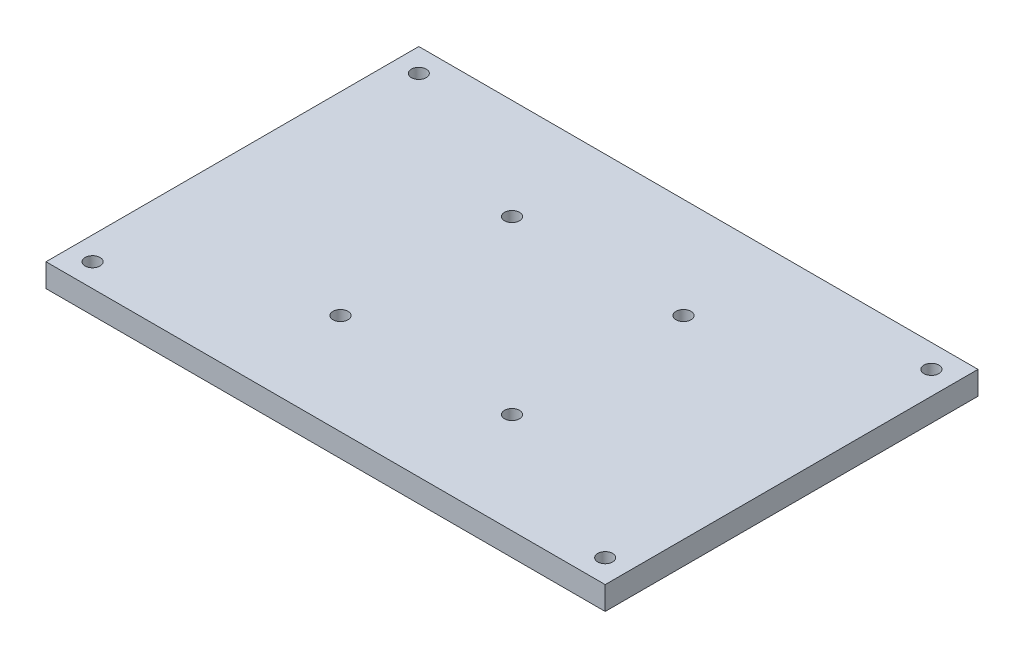
ISO-10303-21;
HEADER;
FILE_DESCRIPTION(('STEP AP214'),'2;1');
FILE_NAME('part.step','',(''),(''),'','','');
FILE_SCHEMA(('AUTOMOTIVE_DESIGN { 1 0 10303 214 1 1 1 1 }'));
ENDSEC;
DATA;
#1=APPLICATION_CONTEXT('core data for automotive mechanical design processes');
#2=APPLICATION_PROTOCOL_DEFINITION('international standard','automotive_design',2000,#1);
#3=PRODUCT_CONTEXT('',#1,'mechanical');
#4=PRODUCT('Part','Part','',(#3));
#5=PRODUCT_RELATED_PRODUCT_CATEGORY('part','',(#4));
#6=PRODUCT_DEFINITION_FORMATION('','',#4);
#7=PRODUCT_DEFINITION_CONTEXT('part definition',#1,'design');
#8=PRODUCT_DEFINITION('design','',#6,#7);
#9=PRODUCT_DEFINITION_SHAPE('','',#8);
#10=(LENGTH_UNIT() NAMED_UNIT(*) SI_UNIT(.MILLI.,.METRE.));
#11=(NAMED_UNIT(*) PLANE_ANGLE_UNIT() SI_UNIT($,.RADIAN.));
#12=(NAMED_UNIT(*) SI_UNIT($,.STERADIAN.) SOLID_ANGLE_UNIT());
#13=UNCERTAINTY_MEASURE_WITH_UNIT(LENGTH_MEASURE(1.E-05),#10,'distance_accuracy_value','');
#14=(GEOMETRIC_REPRESENTATION_CONTEXT(3) GLOBAL_UNCERTAINTY_ASSIGNED_CONTEXT((#13)) GLOBAL_UNIT_ASSIGNED_CONTEXT((#10,
#11,#12)) REPRESENTATION_CONTEXT('',''));
#15=CARTESIAN_POINT('',(0.,0.,0.));
#16=DIRECTION('',(0.,0.,1.));
#17=DIRECTION('',(1.,0.,0.));
#18=AXIS2_PLACEMENT_3D('',#15,#16,#17);
#19=CARTESIAN_POINT('',(0.,5.,0.));
#20=DIRECTION('',(1.,0.,0.));
#21=DIRECTION('',(0.,0.,-1.));
#22=AXIS2_PLACEMENT_3D('',#19,#20,#21);
#23=PLANE('',#22);
#24=DIRECTION('',(0.,0.,1.));
#25=VECTOR('',#24,1.);
#26=CARTESIAN_POINT('',(0.,0.,0.));
#27=LINE('',#26,#25);
#28=CARTESIAN_POINT('',(0.,0.,-80.));
#29=VERTEX_POINT('',#28);
#30=CARTESIAN_POINT('',(0.,0.,0.));
#31=VERTEX_POINT('',#30);
#32=EDGE_CURVE('E95',#29,#31,#27,.T.);
#33=ORIENTED_EDGE('',*,*,#32,.T.);
#34=DIRECTION('',(0.,-1.,0.));
#35=VECTOR('',#34,1.);
#36=CARTESIAN_POINT('',(0.,5.,0.));
#37=LINE('',#36,#35);
#38=CARTESIAN_POINT('',(0.,5.,0.));
#39=VERTEX_POINT('',#38);
#40=EDGE_CURVE('E11',#39,#31,#37,.T.);
#41=ORIENTED_EDGE('',*,*,#40,.F.);
#42=DIRECTION('',(0.,0.,1.));
#43=VECTOR('',#42,1.);
#44=CARTESIAN_POINT('',(0.,5.,0.));
#45=LINE('',#44,#43);
#46=CARTESIAN_POINT('',(0.,5.,-80.));
#47=VERTEX_POINT('',#46);
#48=EDGE_CURVE('E83',#47,#39,#45,.T.);
#49=ORIENTED_EDGE('',*,*,#48,.F.);
#50=DIRECTION('',(0.,-1.,0.));
#51=VECTOR('',#50,1.);
#52=CARTESIAN_POINT('',(0.,5.,-80.));
#53=LINE('',#52,#51);
#54=EDGE_CURVE('E91',#47,#29,#53,.T.);
#55=ORIENTED_EDGE('',*,*,#54,.T.);
#56=EDGE_LOOP('',(#33,#41,#49,#55));
#57=FACE_BOUND('',#56,.T.);
#58=ADVANCED_FACE('F32',(#57),#23,.F.);
#59=CARTESIAN_POINT('',(0.,5.,0.));
#60=DIRECTION('',(0.,0.,-1.));
#61=DIRECTION('',(-1.,0.,0.));
#62=AXIS2_PLACEMENT_3D('',#59,#60,#61);
#63=PLANE('',#62);
#64=DIRECTION('',(1.,0.,0.));
#65=VECTOR('',#64,1.);
#66=CARTESIAN_POINT('',(0.,0.,0.));
#67=LINE('',#66,#65);
#68=CARTESIAN_POINT('',(120.,0.,0.));
#69=VERTEX_POINT('',#68);
#70=EDGE_CURVE('E87',#31,#69,#67,.T.);
#71=ORIENTED_EDGE('',*,*,#70,.T.);
#72=DIRECTION('',(0.,-1.,0.));
#73=VECTOR('',#72,1.);
#74=CARTESIAN_POINT('',(120.,5.,0.));
#75=LINE('',#74,#73);
#76=CARTESIAN_POINT('',(120.,5.,0.));
#77=VERTEX_POINT('',#76);
#78=EDGE_CURVE('E40',#77,#69,#75,.T.);
#79=ORIENTED_EDGE('',*,*,#78,.F.);
#80=DIRECTION('',(1.,0.,0.));
#81=VECTOR('',#80,1.);
#82=CARTESIAN_POINT('',(0.,5.,0.));
#83=LINE('',#82,#81);
#84=EDGE_CURVE('E78',#39,#77,#83,.T.);
#85=ORIENTED_EDGE('',*,*,#84,.F.);
#86=ORIENTED_EDGE('',*,*,#40,.T.);
#87=EDGE_LOOP('',(#71,#79,#85,#86));
#88=FACE_BOUND('',#87,.T.);
#89=ADVANCED_FACE('F86',(#88),#63,.F.);
#90=CARTESIAN_POINT('',(120.,5.,0.));
#91=DIRECTION('',(-1.,0.,0.));
#92=DIRECTION('',(0.,0.,1.));
#93=AXIS2_PLACEMENT_3D('',#90,#91,#92);
#94=PLANE('',#93);
#95=DIRECTION('',(0.,0.,-1.));
#96=VECTOR('',#95,1.);
#97=CARTESIAN_POINT('',(120.,0.,0.));
#98=LINE('',#97,#96);
#99=CARTESIAN_POINT('',(120.,0.,-80.));
#100=VERTEX_POINT('',#99);
#101=EDGE_CURVE('E65',#69,#100,#98,.T.);
#102=ORIENTED_EDGE('',*,*,#101,.T.);
#103=DIRECTION('',(0.,-1.,0.));
#104=VECTOR('',#103,1.);
#105=CARTESIAN_POINT('',(120.,5.,-80.));
#106=LINE('',#105,#104);
#107=CARTESIAN_POINT('',(120.,5.,-80.));
#108=VERTEX_POINT('',#107);
#109=EDGE_CURVE('E88',#108,#100,#106,.T.);
#110=ORIENTED_EDGE('',*,*,#109,.F.);
#111=DIRECTION('',(0.,0.,-1.));
#112=VECTOR('',#111,1.);
#113=CARTESIAN_POINT('',(120.,5.,0.));
#114=LINE('',#113,#112);
#115=EDGE_CURVE('E81',#77,#108,#114,.T.);
#116=ORIENTED_EDGE('',*,*,#115,.F.);
#117=ORIENTED_EDGE('',*,*,#78,.T.);
#118=EDGE_LOOP('',(#102,#110,#116,#117));
#119=FACE_BOUND('',#118,.T.);
#120=ADVANCED_FACE('F89',(#119),#94,.F.);
#121=CARTESIAN_POINT('',(0.,5.,-80.));
#122=DIRECTION('',(0.,0.,1.));
#123=DIRECTION('',(1.,0.,0.));
#124=AXIS2_PLACEMENT_3D('',#121,#122,#123);
#125=PLANE('',#124);
#126=DIRECTION('',(-1.,0.,0.));
#127=VECTOR('',#126,1.);
#128=CARTESIAN_POINT('',(0.,0.,-80.));
#129=LINE('',#128,#127);
#130=EDGE_CURVE('E71',#100,#29,#129,.T.);
#131=ORIENTED_EDGE('',*,*,#130,.T.);
#132=ORIENTED_EDGE('',*,*,#54,.F.);
#133=DIRECTION('',(-1.,0.,0.));
#134=VECTOR('',#133,1.);
#135=CARTESIAN_POINT('',(0.,5.,-80.));
#136=LINE('',#135,#134);
#137=EDGE_CURVE('E48',#108,#47,#136,.T.);
#138=ORIENTED_EDGE('',*,*,#137,.F.);
#139=ORIENTED_EDGE('',*,*,#109,.T.);
#140=EDGE_LOOP('',(#131,#132,#138,#139));
#141=FACE_BOUND('',#140,.T.);
#142=ADVANCED_FACE('F103',(#141),#125,.F.);
#143=CARTESIAN_POINT('',(0.,5.,0.));
#144=DIRECTION('',(0.,-1.,0.));
#145=DIRECTION('',(0.,0.,-1.));
#146=AXIS2_PLACEMENT_3D('',#143,#144,#145);
#147=PLANE('',#146);
#148=CARTESIAN_POINT('',(41.6,5.,-21.6));
#149=DIRECTION('',(0.,1.,0.));
#150=DIRECTION('',(0.,0.,-1.));
#151=AXIS2_PLACEMENT_3D('',#148,#149,#150);
#152=CIRCLE('',#151,1.6);
#153=CARTESIAN_POINT('',(41.6,5.,-23.2));
#154=VERTEX_POINT('',#153);
#155=EDGE_CURVE('E134',#154,#154,#152,.T.);
#156=ORIENTED_EDGE('',*,*,#155,.F.);
#157=EDGE_LOOP('',(#156));
#158=FACE_BOUND('',#157,.T.);
#159=CARTESIAN_POINT('',(78.4,5.,-21.6));
#160=DIRECTION('',(0.,1.,0.));
#161=DIRECTION('',(0.,0.,1.));
#162=AXIS2_PLACEMENT_3D('',#159,#160,#161);
#163=CIRCLE('',#162,1.6);
#164=CARTESIAN_POINT('',(78.4,5.,-20.));
#165=VERTEX_POINT('',#164);
#166=EDGE_CURVE('E128',#165,#165,#163,.T.);
#167=ORIENTED_EDGE('',*,*,#166,.F.);
#168=EDGE_LOOP('',(#167));
#169=FACE_BOUND('',#168,.T.);
#170=CARTESIAN_POINT('',(78.4,5.,-58.4));
#171=DIRECTION('',(0.,1.,0.));
#172=DIRECTION('',(0.,0.,-1.));
#173=AXIS2_PLACEMENT_3D('',#170,#171,#172);
#174=CIRCLE('',#173,1.60000000000001);
#175=CARTESIAN_POINT('',(78.4,5.,-60.));
#176=VERTEX_POINT('',#175);
#177=EDGE_CURVE('E122',#176,#176,#174,.T.);
#178=ORIENTED_EDGE('',*,*,#177,.F.);
#179=EDGE_LOOP('',(#178));
#180=FACE_BOUND('',#179,.T.);
#181=CARTESIAN_POINT('',(5.00000000000001,5.,-75.));
#182=DIRECTION('',(0.,1.,0.));
#183=DIRECTION('',(0.,0.,1.));
#184=AXIS2_PLACEMENT_3D('',#181,#182,#183);
#185=CIRCLE('',#184,1.6);
#186=CARTESIAN_POINT('',(5.00000000000001,5.,-73.4));
#187=VERTEX_POINT('',#186);
#188=EDGE_CURVE('E115',#187,#187,#185,.T.);
#189=ORIENTED_EDGE('',*,*,#188,.F.);
#190=EDGE_LOOP('',(#189));
#191=FACE_BOUND('',#190,.T.);
#192=CARTESIAN_POINT('',(115.,5.,-75.));
#193=DIRECTION('',(0.,1.,0.));
#194=DIRECTION('',(0.,0.,-1.));
#195=AXIS2_PLACEMENT_3D('',#192,#193,#194);
#196=CIRCLE('',#195,1.60000000000001);
#197=CARTESIAN_POINT('',(115.,5.,-76.6));
#198=VERTEX_POINT('',#197);
#199=EDGE_CURVE('E151',#198,#198,#196,.T.);
#200=ORIENTED_EDGE('',*,*,#199,.F.);
#201=EDGE_LOOP('',(#200));
#202=FACE_BOUND('',#201,.T.);
#203=CARTESIAN_POINT('',(115.,5.,-5.00000000000006));
#204=DIRECTION('',(0.,1.,0.));
#205=DIRECTION('',(0.,0.,1.));
#206=AXIS2_PLACEMENT_3D('',#203,#204,#205);
#207=CIRCLE('',#206,1.60000000000001);
#208=CARTESIAN_POINT('',(115.,5.,-3.40000000000005));
#209=VERTEX_POINT('',#208);
#210=EDGE_CURVE('E145',#209,#209,#207,.T.);
#211=ORIENTED_EDGE('',*,*,#210,.F.);
#212=EDGE_LOOP('',(#211));
#213=FACE_BOUND('',#212,.T.);
#214=CARTESIAN_POINT('',(5.00000000000001,5.,-5.00000000000003));
#215=DIRECTION('',(0.,1.,0.));
#216=DIRECTION('',(0.,0.,-1.));
#217=AXIS2_PLACEMENT_3D('',#214,#215,#216);
#218=CIRCLE('',#217,1.6);
#219=CARTESIAN_POINT('',(5.00000000000001,5.,-6.60000000000004));
#220=VERTEX_POINT('',#219);
#221=EDGE_CURVE('E139',#220,#220,#218,.T.);
#222=ORIENTED_EDGE('',*,*,#221,.F.);
#223=EDGE_LOOP('',(#222));
#224=FACE_BOUND('',#223,.T.);
#225=CARTESIAN_POINT('',(41.6,5.,-58.4));
#226=DIRECTION('',(0.,1.,0.));
#227=DIRECTION('',(0.,0.,1.));
#228=AXIS2_PLACEMENT_3D('',#225,#226,#227);
#229=CIRCLE('',#228,1.6);
#230=CARTESIAN_POINT('',(41.6,5.,-56.8));
#231=VERTEX_POINT('',#230);
#232=EDGE_CURVE('E109',#231,#231,#229,.T.);
#233=ORIENTED_EDGE('',*,*,#232,.F.);
#234=EDGE_LOOP('',(#233));
#235=FACE_BOUND('',#234,.T.);
#236=ORIENTED_EDGE('',*,*,#48,.T.);
#237=ORIENTED_EDGE('',*,*,#84,.T.);
#238=ORIENTED_EDGE('',*,*,#115,.T.);
#239=ORIENTED_EDGE('',*,*,#137,.T.);
#240=EDGE_LOOP('',(#236,#237,#238,#239));
#241=FACE_BOUND('',#240,.T.);
#242=ADVANCED_FACE('F79',(#158,#169,#180,#191,#202,#213,#224,#235,#241),#147,.F.);
#243=CARTESIAN_POINT('',(0.,0.,0.));
#244=DIRECTION('',(0.,-1.,0.));
#245=DIRECTION('',(0.,0.,-1.));
#246=AXIS2_PLACEMENT_3D('',#243,#244,#245);
#247=PLANE('',#246);
#248=CARTESIAN_POINT('',(41.6,0.,-21.6));
#249=DIRECTION('',(0.,1.,0.));
#250=DIRECTION('',(0.,0.,-1.));
#251=AXIS2_PLACEMENT_3D('',#248,#249,#250);
#252=CIRCLE('',#251,1.6);
#253=CARTESIAN_POINT('',(41.6,0.,-23.2));
#254=VERTEX_POINT('',#253);
#255=EDGE_CURVE('E112',#254,#254,#252,.T.);
#256=ORIENTED_EDGE('',*,*,#255,.T.);
#257=EDGE_LOOP('',(#256));
#258=FACE_BOUND('',#257,.T.);
#259=CARTESIAN_POINT('',(78.4,0.,-21.6));
#260=DIRECTION('',(0.,1.,0.));
#261=DIRECTION('',(0.,0.,1.));
#262=AXIS2_PLACEMENT_3D('',#259,#260,#261);
#263=CIRCLE('',#262,1.6);
#264=CARTESIAN_POINT('',(78.4,0.,-20.));
#265=VERTEX_POINT('',#264);
#266=EDGE_CURVE('E131',#265,#265,#263,.T.);
#267=ORIENTED_EDGE('',*,*,#266,.T.);
#268=EDGE_LOOP('',(#267));
#269=FACE_BOUND('',#268,.T.);
#270=CARTESIAN_POINT('',(78.4,0.,-58.4));
#271=DIRECTION('',(0.,1.,0.));
#272=DIRECTION('',(0.,0.,-1.));
#273=AXIS2_PLACEMENT_3D('',#270,#271,#272);
#274=CIRCLE('',#273,1.60000000000001);
#275=CARTESIAN_POINT('',(78.4,0.,-60.));
#276=VERTEX_POINT('',#275);
#277=EDGE_CURVE('E125',#276,#276,#274,.T.);
#278=ORIENTED_EDGE('',*,*,#277,.T.);
#279=EDGE_LOOP('',(#278));
#280=FACE_BOUND('',#279,.T.);
#281=CARTESIAN_POINT('',(5.00000000000001,0.,-75.));
#282=DIRECTION('',(0.,1.,0.));
#283=DIRECTION('',(0.,0.,1.));
#284=AXIS2_PLACEMENT_3D('',#281,#282,#283);
#285=CIRCLE('',#284,1.6);
#286=CARTESIAN_POINT('',(5.00000000000001,0.,-73.4));
#287=VERTEX_POINT('',#286);
#288=EDGE_CURVE('E118',#287,#287,#285,.T.);
#289=ORIENTED_EDGE('',*,*,#288,.T.);
#290=EDGE_LOOP('',(#289));
#291=FACE_BOUND('',#290,.T.);
#292=CARTESIAN_POINT('',(115.,0.,-75.));
#293=DIRECTION('',(0.,1.,0.));
#294=DIRECTION('',(0.,0.,-1.));
#295=AXIS2_PLACEMENT_3D('',#292,#293,#294);
#296=CIRCLE('',#295,1.60000000000001);
#297=CARTESIAN_POINT('',(115.,0.,-76.6));
#298=VERTEX_POINT('',#297);
#299=EDGE_CURVE('E119',#298,#298,#296,.T.);
#300=ORIENTED_EDGE('',*,*,#299,.T.);
#301=EDGE_LOOP('',(#300));
#302=FACE_BOUND('',#301,.T.);
#303=CARTESIAN_POINT('',(115.,0.,-5.00000000000006));
#304=DIRECTION('',(0.,1.,0.));
#305=DIRECTION('',(0.,0.,1.));
#306=AXIS2_PLACEMENT_3D('',#303,#304,#305);
#307=CIRCLE('',#306,1.60000000000001);
#308=CARTESIAN_POINT('',(115.,0.,-3.40000000000005));
#309=VERTEX_POINT('',#308);
#310=EDGE_CURVE('E148',#309,#309,#307,.T.);
#311=ORIENTED_EDGE('',*,*,#310,.T.);
#312=EDGE_LOOP('',(#311));
#313=FACE_BOUND('',#312,.T.);
#314=CARTESIAN_POINT('',(5.00000000000001,0.,-5.00000000000003));
#315=DIRECTION('',(0.,1.,0.));
#316=DIRECTION('',(0.,0.,-1.));
#317=AXIS2_PLACEMENT_3D('',#314,#315,#316);
#318=CIRCLE('',#317,1.6);
#319=CARTESIAN_POINT('',(5.00000000000001,0.,-6.60000000000004));
#320=VERTEX_POINT('',#319);
#321=EDGE_CURVE('E142',#320,#320,#318,.T.);
#322=ORIENTED_EDGE('',*,*,#321,.T.);
#323=EDGE_LOOP('',(#322));
#324=FACE_BOUND('',#323,.T.);
#325=CARTESIAN_POINT('',(41.6,0.,-58.4));
#326=DIRECTION('',(0.,1.,0.));
#327=DIRECTION('',(0.,0.,1.));
#328=AXIS2_PLACEMENT_3D('',#325,#326,#327);
#329=CIRCLE('',#328,1.6);
#330=CARTESIAN_POINT('',(41.6,0.,-56.8));
#331=VERTEX_POINT('',#330);
#332=EDGE_CURVE('E98',#331,#331,#329,.T.);
#333=ORIENTED_EDGE('',*,*,#332,.T.);
#334=EDGE_LOOP('',(#333));
#335=FACE_BOUND('',#334,.T.);
#336=ORIENTED_EDGE('',*,*,#32,.F.);
#337=ORIENTED_EDGE('',*,*,#130,.F.);
#338=ORIENTED_EDGE('',*,*,#101,.F.);
#339=ORIENTED_EDGE('',*,*,#70,.F.);
#340=EDGE_LOOP('',(#336,#337,#338,#339));
#341=FACE_BOUND('',#340,.T.);
#342=ADVANCED_FACE('F106',(#258,#269,#280,#291,#302,#313,#324,#335,#341),#247,.T.);
#343=CARTESIAN_POINT('',(41.6,0.,-58.4));
#344=DIRECTION('',(0.,1.,0.));
#345=DIRECTION('',(0.,0.,1.));
#346=AXIS2_PLACEMENT_3D('',#343,#344,#345);
#347=CYLINDRICAL_SURFACE('',#346,1.6);
#348=ORIENTED_EDGE('',*,*,#332,.F.);
#349=EDGE_LOOP('',(#348));
#350=FACE_BOUND('',#349,.T.);
#351=ORIENTED_EDGE('',*,*,#232,.T.);
#352=EDGE_LOOP('',(#351));
#353=FACE_BOUND('',#352,.T.);
#354=ADVANCED_FACE('F177',(#350,#353),#347,.F.);
#355=CARTESIAN_POINT('',(5.00000000000001,0.,-5.00000000000003));
#356=DIRECTION('',(0.,1.,0.));
#357=DIRECTION('',(0.,0.,1.));
#358=AXIS2_PLACEMENT_3D('',#355,#356,#357);
#359=CYLINDRICAL_SURFACE('',#358,1.6);
#360=ORIENTED_EDGE('',*,*,#321,.F.);
#361=EDGE_LOOP('',(#360));
#362=FACE_BOUND('',#361,.T.);
#363=ORIENTED_EDGE('',*,*,#221,.T.);
#364=EDGE_LOOP('',(#363));
#365=FACE_BOUND('',#364,.T.);
#366=ADVANCED_FACE('F179',(#362,#365),#359,.F.);
#367=CARTESIAN_POINT('',(115.,0.,-5.00000000000006));
#368=DIRECTION('',(0.,1.,0.));
#369=DIRECTION('',(0.,0.,1.));
#370=AXIS2_PLACEMENT_3D('',#367,#368,#369);
#371=CYLINDRICAL_SURFACE('',#370,1.60000000000001);
#372=ORIENTED_EDGE('',*,*,#310,.F.);
#373=EDGE_LOOP('',(#372));
#374=FACE_BOUND('',#373,.T.);
#375=ORIENTED_EDGE('',*,*,#210,.T.);
#376=EDGE_LOOP('',(#375));
#377=FACE_BOUND('',#376,.T.);
#378=ADVANCED_FACE('F163',(#374,#377),#371,.F.);
#379=CARTESIAN_POINT('',(115.,0.,-75.));
#380=DIRECTION('',(0.,1.,0.));
#381=DIRECTION('',(0.,0.,1.));
#382=AXIS2_PLACEMENT_3D('',#379,#380,#381);
#383=CYLINDRICAL_SURFACE('',#382,1.60000000000001);
#384=ORIENTED_EDGE('',*,*,#299,.F.);
#385=EDGE_LOOP('',(#384));
#386=FACE_BOUND('',#385,.T.);
#387=ORIENTED_EDGE('',*,*,#199,.T.);
#388=EDGE_LOOP('',(#387));
#389=FACE_BOUND('',#388,.T.);
#390=ADVANCED_FACE('F159',(#386,#389),#383,.F.);
#391=CARTESIAN_POINT('',(5.00000000000001,0.,-75.));
#392=DIRECTION('',(0.,1.,0.));
#393=DIRECTION('',(0.,0.,1.));
#394=AXIS2_PLACEMENT_3D('',#391,#392,#393);
#395=CYLINDRICAL_SURFACE('',#394,1.6);
#396=ORIENTED_EDGE('',*,*,#288,.F.);
#397=EDGE_LOOP('',(#396));
#398=FACE_BOUND('',#397,.T.);
#399=ORIENTED_EDGE('',*,*,#188,.T.);
#400=EDGE_LOOP('',(#399));
#401=FACE_BOUND('',#400,.T.);
#402=ADVANCED_FACE('F162',(#398,#401),#395,.F.);
#403=CARTESIAN_POINT('',(78.4,0.,-58.4));
#404=DIRECTION('',(0.,1.,0.));
#405=DIRECTION('',(0.,0.,1.));
#406=AXIS2_PLACEMENT_3D('',#403,#404,#405);
#407=CYLINDRICAL_SURFACE('',#406,1.60000000000001);
#408=ORIENTED_EDGE('',*,*,#277,.F.);
#409=EDGE_LOOP('',(#408));
#410=FACE_BOUND('',#409,.T.);
#411=ORIENTED_EDGE('',*,*,#177,.T.);
#412=EDGE_LOOP('',(#411));
#413=FACE_BOUND('',#412,.T.);
#414=ADVANCED_FACE('F248',(#410,#413),#407,.F.);
#415=CARTESIAN_POINT('',(78.4,0.,-21.6));
#416=DIRECTION('',(0.,1.,0.));
#417=DIRECTION('',(0.,0.,1.));
#418=AXIS2_PLACEMENT_3D('',#415,#416,#417);
#419=CYLINDRICAL_SURFACE('',#418,1.6);
#420=ORIENTED_EDGE('',*,*,#266,.F.);
#421=EDGE_LOOP('',(#420));
#422=FACE_BOUND('',#421,.T.);
#423=ORIENTED_EDGE('',*,*,#166,.T.);
#424=EDGE_LOOP('',(#423));
#425=FACE_BOUND('',#424,.T.);
#426=ADVANCED_FACE('F257',(#422,#425),#419,.F.);
#427=CARTESIAN_POINT('',(41.6,0.,-21.6));
#428=DIRECTION('',(0.,1.,0.));
#429=DIRECTION('',(0.,0.,1.));
#430=AXIS2_PLACEMENT_3D('',#427,#428,#429);
#431=CYLINDRICAL_SURFACE('',#430,1.6);
#432=ORIENTED_EDGE('',*,*,#255,.F.);
#433=EDGE_LOOP('',(#432));
#434=FACE_BOUND('',#433,.T.);
#435=ORIENTED_EDGE('',*,*,#155,.T.);
#436=EDGE_LOOP('',(#435));
#437=FACE_BOUND('',#436,.T.);
#438=ADVANCED_FACE('F267',(#434,#437),#431,.F.);
#439=CLOSED_SHELL('',(#58,#89,#120,#142,#242,#342,#354,#366,#378,#390,#402,#414,#426,#438));
#440=MANIFOLD_SOLID_BREP('B2',#439);
#441=ADVANCED_BREP_SHAPE_REPRESENTATION('',(#18,#440),#14);
#442=SHAPE_DEFINITION_REPRESENTATION(#9,#441);
ENDSEC;
END-ISO-10303-21;
